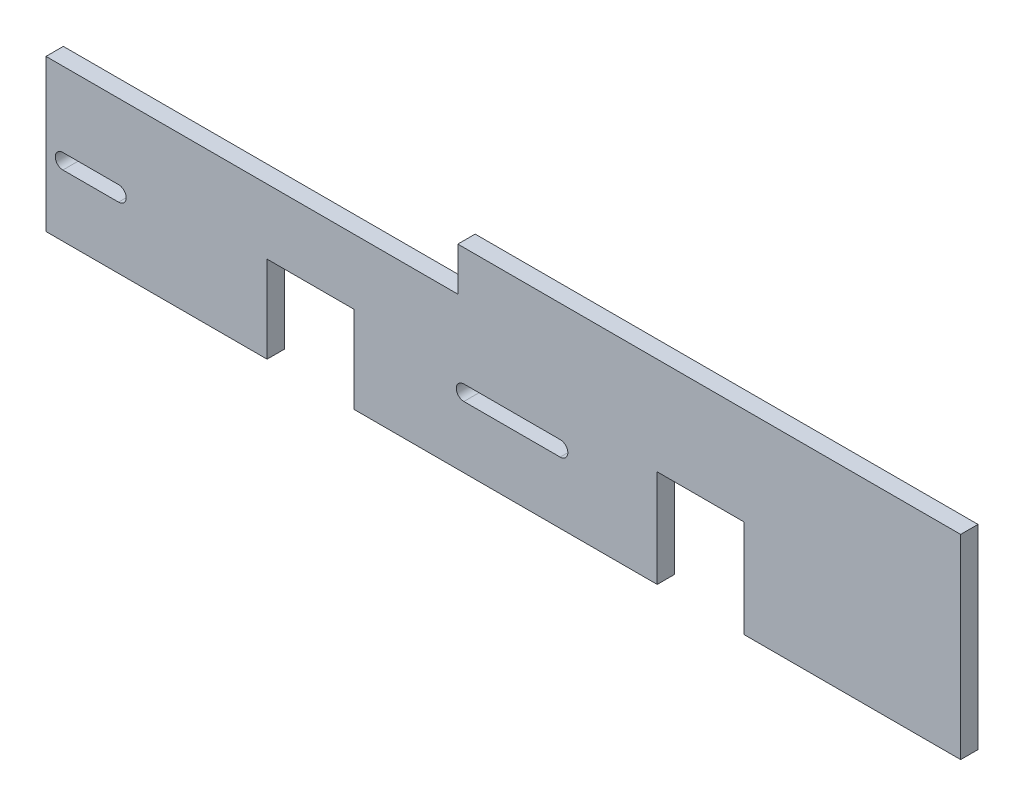
ISO-10303-21;
HEADER;
FILE_DESCRIPTION(('STEP AP214'),'2;1');
FILE_NAME('part.step','',(''),(''),'','','');
FILE_SCHEMA(('AUTOMOTIVE_DESIGN { 1 0 10303 214 1 1 1 1 }'));
ENDSEC;
DATA;
#1=APPLICATION_CONTEXT('core data for automotive mechanical design processes');
#2=APPLICATION_PROTOCOL_DEFINITION('international standard','automotive_design',2000,#1);
#3=PRODUCT_CONTEXT('',#1,'mechanical');
#4=PRODUCT('Part','Part','',(#3));
#5=PRODUCT_RELATED_PRODUCT_CATEGORY('part','',(#4));
#6=PRODUCT_DEFINITION_FORMATION('','',#4);
#7=PRODUCT_DEFINITION_CONTEXT('part definition',#1,'design');
#8=PRODUCT_DEFINITION('design','',#6,#7);
#9=PRODUCT_DEFINITION_SHAPE('','',#8);
#10=(LENGTH_UNIT() NAMED_UNIT(*) SI_UNIT(.MILLI.,.METRE.));
#11=(NAMED_UNIT(*) PLANE_ANGLE_UNIT() SI_UNIT($,.RADIAN.));
#12=(NAMED_UNIT(*) SI_UNIT($,.STERADIAN.) SOLID_ANGLE_UNIT());
#13=UNCERTAINTY_MEASURE_WITH_UNIT(LENGTH_MEASURE(1.E-05),#10,'distance_accuracy_value','');
#14=(GEOMETRIC_REPRESENTATION_CONTEXT(3) GLOBAL_UNCERTAINTY_ASSIGNED_CONTEXT((#13)) GLOBAL_UNIT_ASSIGNED_CONTEXT((#10,
#11,#12)) REPRESENTATION_CONTEXT('',''));
#15=CARTESIAN_POINT('',(0.,0.,0.));
#16=DIRECTION('',(0.,0.,1.));
#17=DIRECTION('',(1.,0.,0.));
#18=AXIS2_PLACEMENT_3D('',#15,#16,#17);
#19=CARTESIAN_POINT('',(-105.5,-22.5,4.));
#20=DIRECTION('',(0.,1.,0.));
#21=DIRECTION('',(0.,0.,1.));
#22=AXIS2_PLACEMENT_3D('',#19,#20,#21);
#23=PLANE('',#22);
#24=DIRECTION('',(1.,0.,0.));
#25=VECTOR('',#24,1.);
#26=CARTESIAN_POINT('',(-105.5,-22.5,4.));
#27=LINE('',#26,#25);
#28=CARTESIAN_POINT('',(-34.5,-22.5,4.));
#29=VERTEX_POINT('',#28);
#30=CARTESIAN_POINT('',(35.5,-22.5,4.));
#31=VERTEX_POINT('',#30);
#32=EDGE_CURVE('E351',#29,#31,#27,.T.);
#33=ORIENTED_EDGE('',*,*,#32,.F.);
#34=DIRECTION('',(0.,0.,-1.));
#35=VECTOR('',#34,1.);
#36=CARTESIAN_POINT('',(-34.5,-22.5,4.001));
#37=LINE('',#36,#35);
#38=CARTESIAN_POINT('',(-34.5,-22.5,0.));
#39=VERTEX_POINT('',#38);
#40=EDGE_CURVE('E300',#29,#39,#37,.T.);
#41=ORIENTED_EDGE('',*,*,#40,.T.);
#42=DIRECTION('',(1.,0.,0.));
#43=VECTOR('',#42,1.);
#44=CARTESIAN_POINT('',(-105.5,-22.5,0.));
#45=LINE('',#44,#43);
#46=CARTESIAN_POINT('',(35.5,-22.5,0.));
#47=VERTEX_POINT('',#46);
#48=EDGE_CURVE('E315',#39,#47,#45,.T.);
#49=ORIENTED_EDGE('',*,*,#48,.T.);
#50=DIRECTION('',(0.,0.,1.));
#51=VECTOR('',#50,1.);
#52=CARTESIAN_POINT('',(35.5,-22.5,-0.00100000000000013));
#53=LINE('',#52,#51);
#54=EDGE_CURVE('E327',#47,#31,#53,.T.);
#55=ORIENTED_EDGE('',*,*,#54,.T.);
#56=EDGE_LOOP('',(#33,#41,#49,#55));
#57=FACE_BOUND('',#56,.T.);
#58=ADVANCED_FACE('F39',(#57),#23,.F.);
#59=CARTESIAN_POINT('',(-105.5,-22.5,0.));
#60=VERTEX_POINT('',#59);
#61=CARTESIAN_POINT('',(-54.5,-22.5,0.));
#62=VERTEX_POINT('',#61);
#63=EDGE_CURVE('E333',#60,#62,#45,.T.);
#64=ORIENTED_EDGE('',*,*,#63,.T.);
#65=DIRECTION('',(0.,0.,-1.));
#66=VECTOR('',#65,1.);
#67=CARTESIAN_POINT('',(-54.5,-22.5,4.001));
#68=LINE('',#67,#66);
#69=CARTESIAN_POINT('',(-54.5,-22.5,4.));
#70=VERTEX_POINT('',#69);
#71=EDGE_CURVE('E299',#70,#62,#68,.T.);
#72=ORIENTED_EDGE('',*,*,#71,.F.);
#73=CARTESIAN_POINT('',(-105.5,-22.5,4.));
#74=VERTEX_POINT('',#73);
#75=EDGE_CURVE('E346',#74,#70,#27,.T.);
#76=ORIENTED_EDGE('',*,*,#75,.F.);
#77=DIRECTION('',(0.,0.,-1.));
#78=VECTOR('',#77,1.);
#79=CARTESIAN_POINT('',(-105.5,-22.5,4.));
#80=LINE('',#79,#78);
#81=EDGE_CURVE('E322',#74,#60,#80,.T.);
#82=ORIENTED_EDGE('',*,*,#81,.T.);
#83=EDGE_LOOP('',(#64,#72,#76,#82));
#84=FACE_BOUND('',#83,.T.);
#85=ADVANCED_FACE('F458',(#84),#23,.F.);
#86=CARTESIAN_POINT('',(105.5,-22.5,4.));
#87=DIRECTION('',(-1.,0.,0.));
#88=DIRECTION('',(0.,0.,1.));
#89=AXIS2_PLACEMENT_3D('',#86,#87,#88);
#90=PLANE('',#89);
#91=DIRECTION('',(0.,1.,0.));
#92=VECTOR('',#91,1.);
#93=CARTESIAN_POINT('',(105.5,-22.5,0.));
#94=LINE('',#93,#92);
#95=CARTESIAN_POINT('',(105.5,-22.5,0.));
#96=VERTEX_POINT('',#95);
#97=CARTESIAN_POINT('',(105.5,22.5,0.));
#98=VERTEX_POINT('',#97);
#99=EDGE_CURVE('E326',#96,#98,#94,.T.);
#100=ORIENTED_EDGE('',*,*,#99,.T.);
#101=DIRECTION('',(0.,0.,-1.));
#102=VECTOR('',#101,1.);
#103=CARTESIAN_POINT('',(105.5,22.5,4.));
#104=LINE('',#103,#102);
#105=CARTESIAN_POINT('',(105.5,22.5,4.));
#106=VERTEX_POINT('',#105);
#107=EDGE_CURVE('E316',#106,#98,#104,.T.);
#108=ORIENTED_EDGE('',*,*,#107,.F.);
#109=DIRECTION('',(0.,1.,0.));
#110=VECTOR('',#109,1.);
#111=CARTESIAN_POINT('',(105.5,-22.5,4.));
#112=LINE('',#111,#110);
#113=CARTESIAN_POINT('',(105.5,-22.5,4.));
#114=VERTEX_POINT('',#113);
#115=EDGE_CURVE('E360',#114,#106,#112,.T.);
#116=ORIENTED_EDGE('',*,*,#115,.F.);
#117=DIRECTION('',(0.,0.,-1.));
#118=VECTOR('',#117,1.);
#119=CARTESIAN_POINT('',(105.5,-22.5,4.));
#120=LINE('',#119,#118);
#121=EDGE_CURVE('E328',#114,#96,#120,.T.);
#122=ORIENTED_EDGE('',*,*,#121,.T.);
#123=EDGE_LOOP('',(#100,#108,#116,#122));
#124=FACE_BOUND('',#123,.T.);
#125=ADVANCED_FACE('F463',(#124),#90,.F.);
#126=CARTESIAN_POINT('',(-105.5,22.5,4.));
#127=DIRECTION('',(0.,-1.,0.));
#128=DIRECTION('',(0.,0.,-1.));
#129=AXIS2_PLACEMENT_3D('',#126,#127,#128);
#130=PLANE('',#129);
#131=DIRECTION('',(-1.,0.,0.));
#132=VECTOR('',#131,1.);
#133=CARTESIAN_POINT('',(-105.5,22.5,0.));
#134=LINE('',#133,#132);
#135=CARTESIAN_POINT('',(-10.5,22.5,0.));
#136=VERTEX_POINT('',#135);
#137=EDGE_CURVE('E332',#98,#136,#134,.T.);
#138=ORIENTED_EDGE('',*,*,#137,.T.);
#139=DIRECTION('',(0.,0.,1.));
#140=VECTOR('',#139,1.);
#141=CARTESIAN_POINT('',(-10.5,22.5,-0.00100000000000013));
#142=LINE('',#141,#140);
#143=CARTESIAN_POINT('',(-10.5,22.5,4.));
#144=VERTEX_POINT('',#143);
#145=EDGE_CURVE('E321',#136,#144,#142,.T.);
#146=ORIENTED_EDGE('',*,*,#145,.T.);
#147=DIRECTION('',(-1.,0.,0.));
#148=VECTOR('',#147,1.);
#149=CARTESIAN_POINT('',(-105.5,22.5,4.));
#150=LINE('',#149,#148);
#151=EDGE_CURVE('E356',#106,#144,#150,.T.);
#152=ORIENTED_EDGE('',*,*,#151,.F.);
#153=ORIENTED_EDGE('',*,*,#107,.T.);
#154=EDGE_LOOP('',(#138,#146,#152,#153));
#155=FACE_BOUND('',#154,.T.);
#156=ADVANCED_FACE('F473',(#155),#130,.F.);
#157=CARTESIAN_POINT('',(-105.5,-22.5,4.));
#158=DIRECTION('',(1.,0.,0.));
#159=DIRECTION('',(0.,0.,-1.));
#160=AXIS2_PLACEMENT_3D('',#157,#158,#159);
#161=PLANE('',#160);
#162=DIRECTION('',(0.,-1.,0.));
#163=VECTOR('',#162,1.);
#164=CARTESIAN_POINT('',(-105.5,-22.5,4.));
#165=LINE('',#164,#163);
#166=CARTESIAN_POINT('',(-105.5,12.5,4.));
#167=VERTEX_POINT('',#166);
#168=EDGE_CURVE('E352',#167,#74,#165,.T.);
#169=ORIENTED_EDGE('',*,*,#168,.F.);
#170=DIRECTION('',(0.,0.,1.));
#171=VECTOR('',#170,1.);
#172=CARTESIAN_POINT('',(-105.5,12.5,-0.00100000000000013));
#173=LINE('',#172,#171);
#174=CARTESIAN_POINT('',(-105.5,12.5,0.));
#175=VERTEX_POINT('',#174);
#176=EDGE_CURVE('E369',#175,#167,#173,.T.);
#177=ORIENTED_EDGE('',*,*,#176,.F.);
#178=DIRECTION('',(0.,-1.,0.));
#179=VECTOR('',#178,1.);
#180=CARTESIAN_POINT('',(-105.5,-22.5,0.));
#181=LINE('',#180,#179);
#182=EDGE_CURVE('E320',#175,#60,#181,.T.);
#183=ORIENTED_EDGE('',*,*,#182,.T.);
#184=ORIENTED_EDGE('',*,*,#81,.F.);
#185=EDGE_LOOP('',(#169,#177,#183,#184));
#186=FACE_BOUND('',#185,.T.);
#187=ADVANCED_FACE('F468',(#186),#161,.F.);
#188=CARTESIAN_POINT('',(55.5,-22.5,4.));
#189=VERTEX_POINT('',#188);
#190=EDGE_CURVE('E350',#189,#114,#27,.T.);
#191=ORIENTED_EDGE('',*,*,#190,.F.);
#192=DIRECTION('',(0.,0.,1.));
#193=VECTOR('',#192,1.);
#194=CARTESIAN_POINT('',(55.5,-22.5,-0.00100000000000013));
#195=LINE('',#194,#193);
#196=CARTESIAN_POINT('',(55.5,-22.5,0.));
#197=VERTEX_POINT('',#196);
#198=EDGE_CURVE('E49',#197,#189,#195,.T.);
#199=ORIENTED_EDGE('',*,*,#198,.F.);
#200=EDGE_CURVE('E337',#197,#96,#45,.T.);
#201=ORIENTED_EDGE('',*,*,#200,.T.);
#202=ORIENTED_EDGE('',*,*,#121,.F.);
#203=EDGE_LOOP('',(#191,#199,#201,#202));
#204=FACE_BOUND('',#203,.T.);
#205=ADVANCED_FACE('F426',(#204),#23,.F.);
#206=CARTESIAN_POINT('',(0.,0.,4.));
#207=DIRECTION('',(0.,0.,-1.));
#208=DIRECTION('',(-1.,0.,0.));
#209=AXIS2_PLACEMENT_3D('',#206,#207,#208);
#210=PLANE('',#209);
#211=CARTESIAN_POINT('',(-9.10055206332183,-6.5,4.));
#212=DIRECTION('',(0.,0.,-1.));
#213=DIRECTION('',(-1.,0.,0.));
#214=AXIS2_PLACEMENT_3D('',#211,#212,#213);
#215=CIRCLE('',#214,1.75);
#216=CARTESIAN_POINT('',(-9.10055206332183,-4.75,4.));
#217=VERTEX_POINT('',#216);
#218=CARTESIAN_POINT('',(-9.10055206332183,-8.25,4.));
#219=VERTEX_POINT('',#218);
#220=EDGE_CURVE('E211',#217,#219,#215,.F.);
#221=ORIENTED_EDGE('',*,*,#220,.F.);
#222=DIRECTION('',(-1.,0.,0.));
#223=VECTOR('',#222,1.);
#224=CARTESIAN_POINT('',(3.79282426745355,-4.75,4.));
#225=LINE('',#224,#223);
#226=CARTESIAN_POINT('',(13.1254913261478,-4.75,4.));
#227=VERTEX_POINT('',#226);
#228=EDGE_CURVE('E193',#227,#217,#225,.T.);
#229=ORIENTED_EDGE('',*,*,#228,.F.);
#230=CARTESIAN_POINT('',(13.1254913261478,-6.5,4.));
#231=DIRECTION('',(0.,0.,-1.));
#232=DIRECTION('',(-1.,0.,0.));
#233=AXIS2_PLACEMENT_3D('',#230,#231,#232);
#234=CIRCLE('',#233,1.75);
#235=CARTESIAN_POINT('',(13.1254913261478,-8.25,4.));
#236=VERTEX_POINT('',#235);
#237=EDGE_CURVE('E202',#236,#227,#234,.F.);
#238=ORIENTED_EDGE('',*,*,#237,.F.);
#239=DIRECTION('',(1.,0.,0.));
#240=VECTOR('',#239,1.);
#241=CARTESIAN_POINT('',(13.1254913261478,-8.25,4.));
#242=LINE('',#241,#240);
#243=EDGE_CURVE('E57',#219,#236,#242,.T.);
#244=ORIENTED_EDGE('',*,*,#243,.F.);
#245=EDGE_LOOP('',(#221,#229,#238,#244));
#246=FACE_BOUND('',#245,.T.);
#247=DIRECTION('',(-1.,0.,0.));
#248=VECTOR('',#247,1.);
#249=CARTESIAN_POINT('',(-101.601478708947,-4.74999999999998,4.));
#250=LINE('',#249,#248);
#251=CARTESIAN_POINT('',(-88.7541837980557,-4.74999999999998,4.));
#252=VERTEX_POINT('',#251);
#253=CARTESIAN_POINT('',(-101.601478708947,-4.74999999999998,4.));
#254=VERTEX_POINT('',#253);
#255=EDGE_CURVE('E240',#252,#254,#250,.T.);
#256=ORIENTED_EDGE('',*,*,#255,.F.);
#257=CARTESIAN_POINT('',(-88.7541837980557,-6.49999999999998,4.));
#258=DIRECTION('',(0.,0.,-1.));
#259=DIRECTION('',(-1.,0.,0.));
#260=AXIS2_PLACEMENT_3D('',#257,#258,#259);
#261=CIRCLE('',#260,1.75);
#262=CARTESIAN_POINT('',(-88.7541837980557,-8.24999999999998,4.));
#263=VERTEX_POINT('',#262);
#264=EDGE_CURVE('E244',#263,#252,#261,.F.);
#265=ORIENTED_EDGE('',*,*,#264,.F.);
#266=DIRECTION('',(1.,0.,0.));
#267=VECTOR('',#266,1.);
#268=CARTESIAN_POINT('',(-101.601478708947,-8.24999999999998,4.));
#269=LINE('',#268,#267);
#270=CARTESIAN_POINT('',(-101.601478708947,-8.24999999999998,4.));
#271=VERTEX_POINT('',#270);
#272=EDGE_CURVE('E267',#271,#263,#269,.T.);
#273=ORIENTED_EDGE('',*,*,#272,.F.);
#274=CARTESIAN_POINT('',(-101.601478708947,-6.49999999999998,4.));
#275=DIRECTION('',(0.,0.,-1.));
#276=DIRECTION('',(-1.,0.,0.));
#277=AXIS2_PLACEMENT_3D('',#274,#275,#276);
#278=CIRCLE('',#277,1.75);
#279=EDGE_CURVE('E206',#254,#271,#278,.F.);
#280=ORIENTED_EDGE('',*,*,#279,.F.);
#281=EDGE_LOOP('',(#256,#265,#273,#280));
#282=FACE_BOUND('',#281,.T.);
#283=DIRECTION('',(-1.,0.,0.));
#284=VECTOR('',#283,1.);
#285=CARTESIAN_POINT('',(-34.5,-2.5,4.));
#286=LINE('',#285,#284);
#287=CARTESIAN_POINT('',(-34.5,-2.5,4.));
#288=VERTEX_POINT('',#287);
#289=CARTESIAN_POINT('',(-54.5,-2.5,4.));
#290=VERTEX_POINT('',#289);
#291=EDGE_CURVE('E280',#288,#290,#286,.T.);
#292=ORIENTED_EDGE('',*,*,#291,.F.);
#293=DIRECTION('',(0.,1.,0.));
#294=VECTOR('',#293,1.);
#295=CARTESIAN_POINT('',(-34.5,-22.5,4.));
#296=LINE('',#295,#294);
#297=EDGE_CURVE('E284',#29,#288,#296,.T.);
#298=ORIENTED_EDGE('',*,*,#297,.F.);
#299=ORIENTED_EDGE('',*,*,#32,.T.);
#300=DIRECTION('',(0.,-1.,0.));
#301=VECTOR('',#300,1.);
#302=CARTESIAN_POINT('',(35.5,0.,4.));
#303=LINE('',#302,#301);
#304=CARTESIAN_POINT('',(35.5,0.,4.));
#305=VERTEX_POINT('',#304);
#306=EDGE_CURVE('E396',#305,#31,#303,.T.);
#307=ORIENTED_EDGE('',*,*,#306,.F.);
#308=DIRECTION('',(-1.,0.,0.));
#309=VECTOR('',#308,1.);
#310=CARTESIAN_POINT('',(55.5,0.,4.));
#311=LINE('',#310,#309);
#312=CARTESIAN_POINT('',(55.5,0.,4.));
#313=VERTEX_POINT('',#312);
#314=EDGE_CURVE('E392',#313,#305,#311,.T.);
#315=ORIENTED_EDGE('',*,*,#314,.F.);
#316=DIRECTION('',(0.,1.,0.));
#317=VECTOR('',#316,1.);
#318=CARTESIAN_POINT('',(55.5,-22.5,4.));
#319=LINE('',#318,#317);
#320=EDGE_CURVE('E11',#189,#313,#319,.T.);
#321=ORIENTED_EDGE('',*,*,#320,.F.);
#322=ORIENTED_EDGE('',*,*,#190,.T.);
#323=ORIENTED_EDGE('',*,*,#115,.T.);
#324=ORIENTED_EDGE('',*,*,#151,.T.);
#325=DIRECTION('',(0.,1.,0.));
#326=VECTOR('',#325,1.);
#327=CARTESIAN_POINT('',(-10.5,22.5,4.));
#328=LINE('',#327,#326);
#329=CARTESIAN_POINT('',(-10.5,12.5,4.));
#330=VERTEX_POINT('',#329);
#331=EDGE_CURVE('E373',#330,#144,#328,.T.);
#332=ORIENTED_EDGE('',*,*,#331,.F.);
#333=DIRECTION('',(1.,0.,0.));
#334=VECTOR('',#333,1.);
#335=CARTESIAN_POINT('',(-105.5,12.5,4.));
#336=LINE('',#335,#334);
#337=EDGE_CURVE('E372',#167,#330,#336,.T.);
#338=ORIENTED_EDGE('',*,*,#337,.F.);
#339=ORIENTED_EDGE('',*,*,#168,.T.);
#340=ORIENTED_EDGE('',*,*,#75,.T.);
#341=DIRECTION('',(0.,-1.,0.));
#342=VECTOR('',#341,1.);
#343=CARTESIAN_POINT('',(-54.5,-2.5,4.));
#344=LINE('',#343,#342);
#345=EDGE_CURVE('E304',#290,#70,#344,.T.);
#346=ORIENTED_EDGE('',*,*,#345,.F.);
#347=EDGE_LOOP('',(#292,#298,#299,#307,#315,#321,#322,#323,#324,#332,#338,#339,#340,#346));
#348=FACE_BOUND('',#347,.T.);
#349=ADVANCED_FACE('F41',(#246,#282,#348),#210,.F.);
#350=CARTESIAN_POINT('',(0.,0.,0.));
#351=DIRECTION('',(0.,0.,-1.));
#352=DIRECTION('',(-1.,0.,0.));
#353=AXIS2_PLACEMENT_3D('',#350,#351,#352);
#354=PLANE('',#353);
#355=DIRECTION('',(1.,0.,0.));
#356=VECTOR('',#355,1.);
#357=CARTESIAN_POINT('',(3.79282426745355,-4.75,0.));
#358=LINE('',#357,#356);
#359=CARTESIAN_POINT('',(-9.10055206332183,-4.75,0.));
#360=VERTEX_POINT('',#359);
#361=CARTESIAN_POINT('',(13.1254913261478,-4.75,0.));
#362=VERTEX_POINT('',#361);
#363=EDGE_CURVE('E65',#360,#362,#358,.T.);
#364=ORIENTED_EDGE('',*,*,#363,.F.);
#365=CARTESIAN_POINT('',(-9.10055206332183,-6.5,0.));
#366=DIRECTION('',(0.,0.,-1.));
#367=DIRECTION('',(-1.,0.,0.));
#368=AXIS2_PLACEMENT_3D('',#365,#366,#367);
#369=CIRCLE('',#368,1.75);
#370=CARTESIAN_POINT('',(-9.10055206332183,-8.25,0.));
#371=VERTEX_POINT('',#370);
#372=EDGE_CURVE('E225',#371,#360,#369,.T.);
#373=ORIENTED_EDGE('',*,*,#372,.F.);
#374=DIRECTION('',(-1.,0.,0.));
#375=VECTOR('',#374,1.);
#376=CARTESIAN_POINT('',(13.1254913261478,-8.25,0.));
#377=LINE('',#376,#375);
#378=CARTESIAN_POINT('',(13.1254913261478,-8.25,0.));
#379=VERTEX_POINT('',#378);
#380=EDGE_CURVE('E217',#379,#371,#377,.T.);
#381=ORIENTED_EDGE('',*,*,#380,.F.);
#382=CARTESIAN_POINT('',(13.1254913261478,-6.5,0.));
#383=DIRECTION('',(0.,0.,-1.));
#384=DIRECTION('',(-1.,0.,0.));
#385=AXIS2_PLACEMENT_3D('',#382,#383,#384);
#386=CIRCLE('',#385,1.75);
#387=EDGE_CURVE('E213',#362,#379,#386,.T.);
#388=ORIENTED_EDGE('',*,*,#387,.F.);
#389=EDGE_LOOP('',(#364,#373,#381,#388));
#390=FACE_BOUND('',#389,.T.);
#391=CARTESIAN_POINT('',(-88.7541837980557,-6.49999999999998,0.));
#392=DIRECTION('',(0.,0.,-1.));
#393=DIRECTION('',(1.,0.,0.));
#394=AXIS2_PLACEMENT_3D('',#391,#392,#393);
#395=CIRCLE('',#394,1.75);
#396=CARTESIAN_POINT('',(-88.7541837980557,-4.74999999999998,0.));
#397=VERTEX_POINT('',#396);
#398=CARTESIAN_POINT('',(-88.7541837980557,-8.24999999999998,0.));
#399=VERTEX_POINT('',#398);
#400=EDGE_CURVE('E248',#397,#399,#395,.T.);
#401=ORIENTED_EDGE('',*,*,#400,.F.);
#402=DIRECTION('',(1.,0.,0.));
#403=VECTOR('',#402,1.);
#404=CARTESIAN_POINT('',(-101.601478708947,-4.74999999999998,0.));
#405=LINE('',#404,#403);
#406=CARTESIAN_POINT('',(-101.601478708947,-4.74999999999998,0.));
#407=VERTEX_POINT('',#406);
#408=EDGE_CURVE('E259',#407,#397,#405,.T.);
#409=ORIENTED_EDGE('',*,*,#408,.F.);
#410=CARTESIAN_POINT('',(-101.601478708947,-6.49999999999998,0.));
#411=DIRECTION('',(0.,0.,-1.));
#412=DIRECTION('',(1.,0.,0.));
#413=AXIS2_PLACEMENT_3D('',#410,#411,#412);
#414=CIRCLE('',#413,1.75);
#415=CARTESIAN_POINT('',(-101.601478708947,-8.24999999999998,0.));
#416=VERTEX_POINT('',#415);
#417=EDGE_CURVE('E255',#416,#407,#414,.T.);
#418=ORIENTED_EDGE('',*,*,#417,.F.);
#419=DIRECTION('',(-1.,0.,0.));
#420=VECTOR('',#419,1.);
#421=CARTESIAN_POINT('',(-101.601478708947,-8.24999999999998,0.));
#422=LINE('',#421,#420);
#423=EDGE_CURVE('E251',#399,#416,#422,.T.);
#424=ORIENTED_EDGE('',*,*,#423,.F.);
#425=EDGE_LOOP('',(#401,#409,#418,#424));
#426=FACE_BOUND('',#425,.T.);
#427=DIRECTION('',(0.,-1.,0.));
#428=VECTOR('',#427,1.);
#429=CARTESIAN_POINT('',(-34.5,-22.5,0.));
#430=LINE('',#429,#428);
#431=CARTESIAN_POINT('',(-34.5,-2.5,0.));
#432=VERTEX_POINT('',#431);
#433=EDGE_CURVE('E296',#432,#39,#430,.T.);
#434=ORIENTED_EDGE('',*,*,#433,.F.);
#435=DIRECTION('',(1.,0.,0.));
#436=VECTOR('',#435,1.);
#437=CARTESIAN_POINT('',(-34.5,-2.5,0.));
#438=LINE('',#437,#436);
#439=CARTESIAN_POINT('',(-54.5,-2.5,0.));
#440=VERTEX_POINT('',#439);
#441=EDGE_CURVE('E292',#440,#432,#438,.T.);
#442=ORIENTED_EDGE('',*,*,#441,.F.);
#443=DIRECTION('',(0.,1.,0.));
#444=VECTOR('',#443,1.);
#445=CARTESIAN_POINT('',(-54.5,-2.5,0.));
#446=LINE('',#445,#444);
#447=EDGE_CURVE('E288',#62,#440,#446,.T.);
#448=ORIENTED_EDGE('',*,*,#447,.F.);
#449=ORIENTED_EDGE('',*,*,#63,.F.);
#450=ORIENTED_EDGE('',*,*,#182,.F.);
#451=DIRECTION('',(1.,0.,0.));
#452=VECTOR('',#451,1.);
#453=CARTESIAN_POINT('',(-105.5,12.5,0.));
#454=LINE('',#453,#452);
#455=CARTESIAN_POINT('',(-10.5,12.5,0.));
#456=VERTEX_POINT('',#455);
#457=EDGE_CURVE('E364',#175,#456,#454,.T.);
#458=ORIENTED_EDGE('',*,*,#457,.T.);
#459=DIRECTION('',(0.,1.,0.));
#460=VECTOR('',#459,1.);
#461=CARTESIAN_POINT('',(-10.5,22.5,0.));
#462=LINE('',#461,#460);
#463=EDGE_CURVE('E368',#456,#136,#462,.T.);
#464=ORIENTED_EDGE('',*,*,#463,.T.);
#465=ORIENTED_EDGE('',*,*,#137,.F.);
#466=ORIENTED_EDGE('',*,*,#99,.F.);
#467=ORIENTED_EDGE('',*,*,#200,.F.);
#468=DIRECTION('',(0.,1.,0.));
#469=VECTOR('',#468,1.);
#470=CARTESIAN_POINT('',(55.5,-22.5,0.));
#471=LINE('',#470,#469);
#472=CARTESIAN_POINT('',(55.5,0.,0.));
#473=VERTEX_POINT('',#472);
#474=EDGE_CURVE('E43',#197,#473,#471,.T.);
#475=ORIENTED_EDGE('',*,*,#474,.T.);
#476=DIRECTION('',(-1.,0.,0.));
#477=VECTOR('',#476,1.);
#478=CARTESIAN_POINT('',(55.5,0.,0.));
#479=LINE('',#478,#477);
#480=CARTESIAN_POINT('',(35.5,0.,0.));
#481=VERTEX_POINT('',#480);
#482=EDGE_CURVE('E377',#473,#481,#479,.T.);
#483=ORIENTED_EDGE('',*,*,#482,.T.);
#484=DIRECTION('',(0.,-1.,0.));
#485=VECTOR('',#484,1.);
#486=CARTESIAN_POINT('',(35.5,0.,0.));
#487=LINE('',#486,#485);
#488=EDGE_CURVE('E355',#481,#47,#487,.T.);
#489=ORIENTED_EDGE('',*,*,#488,.T.);
#490=ORIENTED_EDGE('',*,*,#48,.F.);
#491=EDGE_LOOP('',(#434,#442,#448,#449,#450,#458,#464,#465,#466,#467,#475,#483,#489,#490));
#492=FACE_BOUND('',#491,.T.);
#493=ADVANCED_FACE('F418',(#390,#426,#492),#354,.T.);
#494=CARTESIAN_POINT('',(-10.5,22.5,-0.00100000000000013));
#495=DIRECTION('',(1.,0.,0.));
#496=DIRECTION('',(0.,1.,0.));
#497=AXIS2_PLACEMENT_3D('',#494,#495,#496);
#498=PLANE('',#497);
#499=DIRECTION('',(0.,0.,1.));
#500=VECTOR('',#499,1.);
#501=CARTESIAN_POINT('',(-10.5,12.5,-0.00100000000000013));
#502=LINE('',#501,#500);
#503=EDGE_CURVE('E374',#456,#330,#502,.T.);
#504=ORIENTED_EDGE('',*,*,#503,.T.);
#505=ORIENTED_EDGE('',*,*,#331,.T.);
#506=ORIENTED_EDGE('',*,*,#145,.F.);
#507=ORIENTED_EDGE('',*,*,#463,.F.);
#508=EDGE_LOOP('',(#504,#505,#506,#507));
#509=FACE_BOUND('',#508,.T.);
#510=ADVANCED_FACE('F612',(#509),#498,.F.);
#511=CARTESIAN_POINT('',(-105.5,12.5,-0.00100000000000013));
#512=DIRECTION('',(0.,-1.,0.));
#513=DIRECTION('',(0.,0.,-1.));
#514=AXIS2_PLACEMENT_3D('',#511,#512,#513);
#515=PLANE('',#514);
#516=ORIENTED_EDGE('',*,*,#176,.T.);
#517=ORIENTED_EDGE('',*,*,#337,.T.);
#518=ORIENTED_EDGE('',*,*,#503,.F.);
#519=ORIENTED_EDGE('',*,*,#457,.F.);
#520=EDGE_LOOP('',(#516,#517,#518,#519));
#521=FACE_BOUND('',#520,.T.);
#522=ADVANCED_FACE('F455',(#521),#515,.F.);
#523=CARTESIAN_POINT('',(35.5,0.,-0.00100000000000013));
#524=DIRECTION('',(-1.,0.,0.));
#525=DIRECTION('',(0.,-1.,0.));
#526=AXIS2_PLACEMENT_3D('',#523,#524,#525);
#527=PLANE('',#526);
#528=DIRECTION('',(0.,0.,1.));
#529=VECTOR('',#528,1.);
#530=CARTESIAN_POINT('',(35.5,0.,-0.00100000000000013));
#531=LINE('',#530,#529);
#532=EDGE_CURVE('E386',#481,#305,#531,.T.);
#533=ORIENTED_EDGE('',*,*,#532,.T.);
#534=ORIENTED_EDGE('',*,*,#306,.T.);
#535=ORIENTED_EDGE('',*,*,#54,.F.);
#536=ORIENTED_EDGE('',*,*,#488,.F.);
#537=EDGE_LOOP('',(#533,#534,#535,#536));
#538=FACE_BOUND('',#537,.T.);
#539=ADVANCED_FACE('F441',(#538),#527,.F.);
#540=CARTESIAN_POINT('',(55.5,0.,-0.00100000000000013));
#541=DIRECTION('',(0.,1.,0.));
#542=DIRECTION('',(-1.,0.,0.));
#543=AXIS2_PLACEMENT_3D('',#540,#541,#542);
#544=PLANE('',#543);
#545=DIRECTION('',(0.,0.,1.));
#546=VECTOR('',#545,1.);
#547=CARTESIAN_POINT('',(55.5,0.,-0.00100000000000013));
#548=LINE('',#547,#546);
#549=EDGE_CURVE('E393',#473,#313,#548,.T.);
#550=ORIENTED_EDGE('',*,*,#549,.T.);
#551=ORIENTED_EDGE('',*,*,#314,.T.);
#552=ORIENTED_EDGE('',*,*,#532,.F.);
#553=ORIENTED_EDGE('',*,*,#482,.F.);
#554=EDGE_LOOP('',(#550,#551,#552,#553));
#555=FACE_BOUND('',#554,.T.);
#556=ADVANCED_FACE('F446',(#555),#544,.F.);
#557=CARTESIAN_POINT('',(55.5,-22.5,-0.00100000000000013));
#558=DIRECTION('',(1.,0.,0.));
#559=DIRECTION('',(0.,1.,0.));
#560=AXIS2_PLACEMENT_3D('',#557,#558,#559);
#561=PLANE('',#560);
#562=ORIENTED_EDGE('',*,*,#198,.T.);
#563=ORIENTED_EDGE('',*,*,#320,.T.);
#564=ORIENTED_EDGE('',*,*,#549,.F.);
#565=ORIENTED_EDGE('',*,*,#474,.F.);
#566=EDGE_LOOP('',(#562,#563,#564,#565));
#567=FACE_BOUND('',#566,.T.);
#568=ADVANCED_FACE('F422',(#567),#561,.F.);
#569=CARTESIAN_POINT('',(-34.5,-22.5,4.001));
#570=DIRECTION('',(1.,0.,0.));
#571=DIRECTION('',(0.,0.,-1.));
#572=AXIS2_PLACEMENT_3D('',#569,#570,#571);
#573=PLANE('',#572);
#574=ORIENTED_EDGE('',*,*,#297,.T.);
#575=DIRECTION('',(0.,0.,-1.));
#576=VECTOR('',#575,1.);
#577=CARTESIAN_POINT('',(-34.5,-2.5,4.001));
#578=LINE('',#577,#576);
#579=EDGE_CURVE('E305',#288,#432,#578,.T.);
#580=ORIENTED_EDGE('',*,*,#579,.T.);
#581=ORIENTED_EDGE('',*,*,#433,.T.);
#582=ORIENTED_EDGE('',*,*,#40,.F.);
#583=EDGE_LOOP('',(#574,#580,#581,#582));
#584=FACE_BOUND('',#583,.T.);
#585=ADVANCED_FACE('F453',(#584),#573,.F.);
#586=CARTESIAN_POINT('',(-34.5,-2.5,4.001));
#587=DIRECTION('',(0.,1.,0.));
#588=DIRECTION('',(0.,0.,1.));
#589=AXIS2_PLACEMENT_3D('',#586,#587,#588);
#590=PLANE('',#589);
#591=ORIENTED_EDGE('',*,*,#291,.T.);
#592=DIRECTION('',(0.,0.,-1.));
#593=VECTOR('',#592,1.);
#594=CARTESIAN_POINT('',(-54.5,-2.5,4.001));
#595=LINE('',#594,#593);
#596=EDGE_CURVE('E308',#290,#440,#595,.T.);
#597=ORIENTED_EDGE('',*,*,#596,.T.);
#598=ORIENTED_EDGE('',*,*,#441,.T.);
#599=ORIENTED_EDGE('',*,*,#579,.F.);
#600=EDGE_LOOP('',(#591,#597,#598,#599));
#601=FACE_BOUND('',#600,.T.);
#602=ADVANCED_FACE('F489',(#601),#590,.F.);
#603=CARTESIAN_POINT('',(-54.5,-2.5,4.001));
#604=DIRECTION('',(-1.,0.,0.));
#605=DIRECTION('',(0.,0.,1.));
#606=AXIS2_PLACEMENT_3D('',#603,#604,#605);
#607=PLANE('',#606);
#608=ORIENTED_EDGE('',*,*,#345,.T.);
#609=ORIENTED_EDGE('',*,*,#71,.T.);
#610=ORIENTED_EDGE('',*,*,#447,.T.);
#611=ORIENTED_EDGE('',*,*,#596,.F.);
#612=EDGE_LOOP('',(#608,#609,#610,#611));
#613=FACE_BOUND('',#612,.T.);
#614=ADVANCED_FACE('F485',(#613),#607,.F.);
#615=CARTESIAN_POINT('',(-88.7541837980557,-6.49999999999998,4.001));
#616=DIRECTION('',(0.,0.,-1.));
#617=DIRECTION('',(-1.,0.,0.));
#618=AXIS2_PLACEMENT_3D('',#615,#616,#617);
#619=CYLINDRICAL_SURFACE('',#618,1.75);
#620=ORIENTED_EDGE('',*,*,#264,.T.);
#621=DIRECTION('',(0.,0.,-1.));
#622=VECTOR('',#621,1.);
#623=CARTESIAN_POINT('',(-88.7541837980557,-4.74999999999998,4.001));
#624=LINE('',#623,#622);
#625=EDGE_CURVE('E264',#252,#397,#624,.T.);
#626=ORIENTED_EDGE('',*,*,#625,.T.);
#627=ORIENTED_EDGE('',*,*,#400,.T.);
#628=DIRECTION('',(0.,0.,-1.));
#629=VECTOR('',#628,1.);
#630=CARTESIAN_POINT('',(-88.7541837980557,-8.24999999999998,4.001));
#631=LINE('',#630,#629);
#632=EDGE_CURVE('E263',#263,#399,#631,.T.);
#633=ORIENTED_EDGE('',*,*,#632,.F.);
#634=EDGE_LOOP('',(#620,#626,#627,#633));
#635=FACE_BOUND('',#634,.T.);
#636=ADVANCED_FACE('F488',(#635),#619,.F.);
#637=CARTESIAN_POINT('',(-101.601478708947,-4.74999999999998,4.001));
#638=DIRECTION('',(0.,1.,0.));
#639=DIRECTION('',(0.,0.,1.));
#640=AXIS2_PLACEMENT_3D('',#637,#638,#639);
#641=PLANE('',#640);
#642=ORIENTED_EDGE('',*,*,#255,.T.);
#643=DIRECTION('',(0.,0.,-1.));
#644=VECTOR('',#643,1.);
#645=CARTESIAN_POINT('',(-101.601478708947,-4.74999999999998,4.001));
#646=LINE('',#645,#644);
#647=EDGE_CURVE('E268',#254,#407,#646,.T.);
#648=ORIENTED_EDGE('',*,*,#647,.T.);
#649=ORIENTED_EDGE('',*,*,#408,.T.);
#650=ORIENTED_EDGE('',*,*,#625,.F.);
#651=EDGE_LOOP('',(#642,#648,#649,#650));
#652=FACE_BOUND('',#651,.T.);
#653=ADVANCED_FACE('F499',(#652),#641,.F.);
#654=CARTESIAN_POINT('',(-101.601478708947,-6.49999999999998,4.001));
#655=DIRECTION('',(0.,0.,-1.));
#656=DIRECTION('',(-1.,0.,0.));
#657=AXIS2_PLACEMENT_3D('',#654,#655,#656);
#658=CYLINDRICAL_SURFACE('',#657,1.75);
#659=ORIENTED_EDGE('',*,*,#279,.T.);
#660=DIRECTION('',(0.,0.,-1.));
#661=VECTOR('',#660,1.);
#662=CARTESIAN_POINT('',(-101.601478708947,-8.24999999999998,4.001));
#663=LINE('',#662,#661);
#664=EDGE_CURVE('E271',#271,#416,#663,.T.);
#665=ORIENTED_EDGE('',*,*,#664,.T.);
#666=ORIENTED_EDGE('',*,*,#417,.T.);
#667=ORIENTED_EDGE('',*,*,#647,.F.);
#668=EDGE_LOOP('',(#659,#665,#666,#667));
#669=FACE_BOUND('',#668,.T.);
#670=ADVANCED_FACE('F504',(#669),#658,.F.);
#671=CARTESIAN_POINT('',(-101.601478708947,-8.24999999999998,4.001));
#672=DIRECTION('',(0.,-1.,0.));
#673=DIRECTION('',(0.,0.,-1.));
#674=AXIS2_PLACEMENT_3D('',#671,#672,#673);
#675=PLANE('',#674);
#676=ORIENTED_EDGE('',*,*,#272,.T.);
#677=ORIENTED_EDGE('',*,*,#632,.T.);
#678=ORIENTED_EDGE('',*,*,#423,.T.);
#679=ORIENTED_EDGE('',*,*,#664,.F.);
#680=EDGE_LOOP('',(#676,#677,#678,#679));
#681=FACE_BOUND('',#680,.T.);
#682=ADVANCED_FACE('F501',(#681),#675,.F.);
#683=CARTESIAN_POINT('',(3.79282426745355,-4.75,4.001));
#684=DIRECTION('',(0.,1.,0.));
#685=DIRECTION('',(0.,0.,1.));
#686=AXIS2_PLACEMENT_3D('',#683,#684,#685);
#687=PLANE('',#686);
#688=ORIENTED_EDGE('',*,*,#228,.T.);
#689=DIRECTION('',(0.,0.,-1.));
#690=VECTOR('',#689,1.);
#691=CARTESIAN_POINT('',(-9.10055206332183,-4.75,4.001));
#692=LINE('',#691,#690);
#693=EDGE_CURVE('E207',#217,#360,#692,.T.);
#694=ORIENTED_EDGE('',*,*,#693,.T.);
#695=ORIENTED_EDGE('',*,*,#363,.T.);
#696=DIRECTION('',(0.,0.,-1.));
#697=VECTOR('',#696,1.);
#698=CARTESIAN_POINT('',(13.1254913261478,-4.75,4.001));
#699=LINE('',#698,#697);
#700=EDGE_CURVE('E189',#227,#362,#699,.T.);
#701=ORIENTED_EDGE('',*,*,#700,.F.);
#702=EDGE_LOOP('',(#688,#694,#695,#701));
#703=FACE_BOUND('',#702,.T.);
#704=ADVANCED_FACE('F191',(#703),#687,.F.);
#705=CARTESIAN_POINT('',(-9.10055206332183,-6.5,4.001));
#706=DIRECTION('',(0.,0.,-1.));
#707=DIRECTION('',(-1.,0.,0.));
#708=AXIS2_PLACEMENT_3D('',#705,#706,#707);
#709=CYLINDRICAL_SURFACE('',#708,1.75);
#710=ORIENTED_EDGE('',*,*,#220,.T.);
#711=DIRECTION('',(0.,0.,-1.));
#712=VECTOR('',#711,1.);
#713=CARTESIAN_POINT('',(-9.10055206332183,-8.25,4.001));
#714=LINE('',#713,#712);
#715=EDGE_CURVE('E233',#219,#371,#714,.T.);
#716=ORIENTED_EDGE('',*,*,#715,.T.);
#717=ORIENTED_EDGE('',*,*,#372,.T.);
#718=ORIENTED_EDGE('',*,*,#693,.F.);
#719=EDGE_LOOP('',(#710,#716,#717,#718));
#720=FACE_BOUND('',#719,.T.);
#721=ADVANCED_FACE('F517',(#720),#709,.F.);
#722=CARTESIAN_POINT('',(13.1254913261478,-8.25,4.001));
#723=DIRECTION('',(0.,-1.,0.));
#724=DIRECTION('',(0.,0.,-1.));
#725=AXIS2_PLACEMENT_3D('',#722,#723,#724);
#726=PLANE('',#725);
#727=ORIENTED_EDGE('',*,*,#243,.T.);
#728=DIRECTION('',(0.,0.,-1.));
#729=VECTOR('',#728,1.);
#730=CARTESIAN_POINT('',(13.1254913261478,-8.25,4.001));
#731=LINE('',#730,#729);
#732=EDGE_CURVE('E199',#236,#379,#731,.T.);
#733=ORIENTED_EDGE('',*,*,#732,.T.);
#734=ORIENTED_EDGE('',*,*,#380,.T.);
#735=ORIENTED_EDGE('',*,*,#715,.F.);
#736=EDGE_LOOP('',(#727,#733,#734,#735));
#737=FACE_BOUND('',#736,.T.);
#738=ADVANCED_FACE('F514',(#737),#726,.F.);
#739=CARTESIAN_POINT('',(13.1254913261478,-6.5,4.001));
#740=DIRECTION('',(0.,0.,-1.));
#741=DIRECTION('',(-1.,0.,0.));
#742=AXIS2_PLACEMENT_3D('',#739,#740,#741);
#743=CYLINDRICAL_SURFACE('',#742,1.75);
#744=ORIENTED_EDGE('',*,*,#237,.T.);
#745=ORIENTED_EDGE('',*,*,#700,.T.);
#746=ORIENTED_EDGE('',*,*,#387,.T.);
#747=ORIENTED_EDGE('',*,*,#732,.F.);
#748=EDGE_LOOP('',(#744,#745,#746,#747));
#749=FACE_BOUND('',#748,.T.);
#750=ADVANCED_FACE('F203',(#749),#743,.F.);
#751=CLOSED_SHELL('',(#58,#85,#125,#156,#187,#205,#349,#493,#510,#522,#539,#556,#568,#585,#602,
#614,#636,#653,#670,#682,#704,#721,#738,#750));
#752=MANIFOLD_SOLID_BREP('B2',#751);
#753=ADVANCED_BREP_SHAPE_REPRESENTATION('',(#18,#752),#14);
#754=SHAPE_DEFINITION_REPRESENTATION(#9,#753);
ENDSEC;
END-ISO-10303-21;
